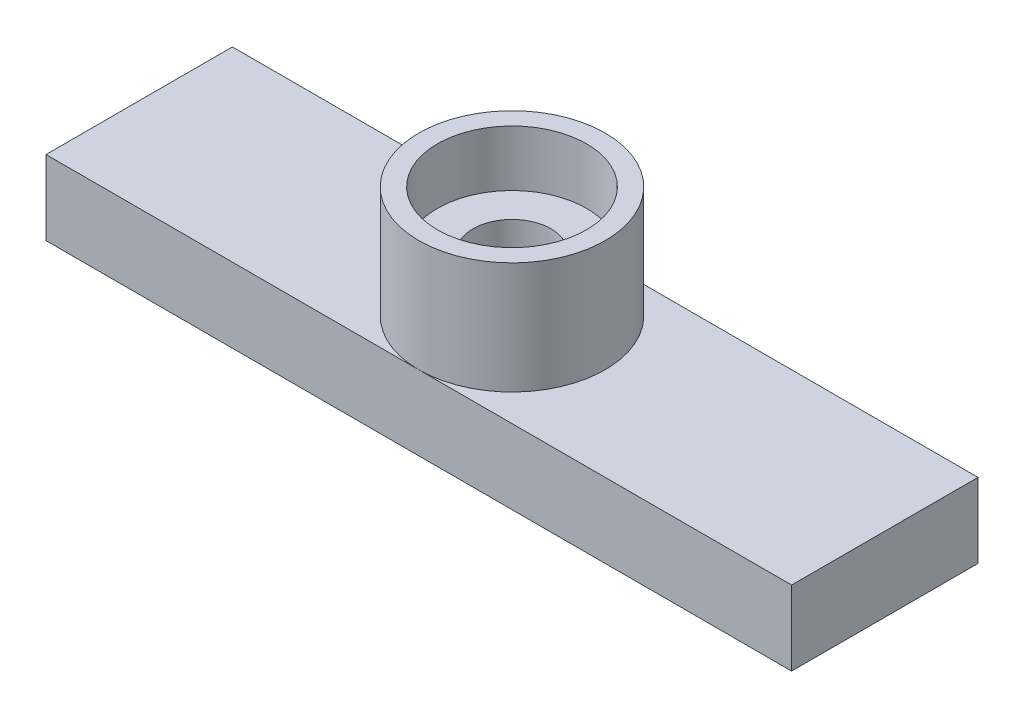
ISO-10303-21;
HEADER;
FILE_DESCRIPTION(('STEP AP214'),'2;1');
FILE_NAME('part.step','',(''),(''),'','','');
FILE_SCHEMA(('AUTOMOTIVE_DESIGN { 1 0 10303 214 1 1 1 1 }'));
ENDSEC;
DATA;
#1=APPLICATION_CONTEXT('core data for automotive mechanical design processes');
#2=APPLICATION_PROTOCOL_DEFINITION('international standard','automotive_design',2000,#1);
#3=PRODUCT_CONTEXT('',#1,'mechanical');
#4=PRODUCT('Part','Part','',(#3));
#5=PRODUCT_RELATED_PRODUCT_CATEGORY('part','',(#4));
#6=PRODUCT_DEFINITION_FORMATION('','',#4);
#7=PRODUCT_DEFINITION_CONTEXT('part definition',#1,'design');
#8=PRODUCT_DEFINITION('design','',#6,#7);
#9=PRODUCT_DEFINITION_SHAPE('','',#8);
#10=(LENGTH_UNIT() NAMED_UNIT(*) SI_UNIT(.MILLI.,.METRE.));
#11=(NAMED_UNIT(*) PLANE_ANGLE_UNIT() SI_UNIT($,.RADIAN.));
#12=(NAMED_UNIT(*) SI_UNIT($,.STERADIAN.) SOLID_ANGLE_UNIT());
#13=UNCERTAINTY_MEASURE_WITH_UNIT(LENGTH_MEASURE(1.E-05),#10,'distance_accuracy_value','');
#14=(GEOMETRIC_REPRESENTATION_CONTEXT(3) GLOBAL_UNCERTAINTY_ASSIGNED_CONTEXT((#13)) GLOBAL_UNIT_ASSIGNED_CONTEXT((#10,
#11,#12)) REPRESENTATION_CONTEXT('',''));
#15=CARTESIAN_POINT('',(0.,0.,0.));
#16=DIRECTION('',(0.,0.,1.));
#17=DIRECTION('',(1.,0.,0.));
#18=AXIS2_PLACEMENT_3D('',#15,#16,#17);
#19=CARTESIAN_POINT('',(0.,0.,0.));
#20=DIRECTION('',(0.,1.,0.));
#21=DIRECTION('',(0.,0.,1.));
#22=AXIS2_PLACEMENT_3D('',#19,#20,#21);
#23=PLANE('',#22);
#24=CARTESIAN_POINT('',(0.,0.,0.));
#25=DIRECTION('',(0.,1.,0.));
#26=DIRECTION('',(0.,0.,1.));
#27=AXIS2_PLACEMENT_3D('',#24,#25,#26);
#28=CIRCLE('',#27,2.1);
#29=CARTESIAN_POINT('',(0.,0.,2.1));
#30=VERTEX_POINT('',#29);
#31=EDGE_CURVE('E36',#30,#30,#28,.T.);
#32=ORIENTED_EDGE('',*,*,#31,.T.);
#33=EDGE_LOOP('',(#32));
#34=FACE_BOUND('',#33,.T.);
#35=CARTESIAN_POINT('',(0.,0.,0.));
#36=DIRECTION('',(0.,1.,0.));
#37=DIRECTION('',(0.,0.,1.));
#38=AXIS2_PLACEMENT_3D('',#35,#36,#37);
#39=CIRCLE('',#38,4.);
#40=CARTESIAN_POINT('',(0.,0.,4.));
#41=VERTEX_POINT('',#40);
#42=EDGE_CURVE('E11',#41,#41,#39,.T.);
#43=ORIENTED_EDGE('',*,*,#42,.F.);
#44=EDGE_LOOP('',(#43));
#45=FACE_BOUND('',#44,.T.);
#46=ADVANCED_FACE('F33',(#34,#45),#23,.F.);
#47=CARTESIAN_POINT('',(0.,3.,0.));
#48=DIRECTION('',(0.,1.,0.));
#49=DIRECTION('',(0.,0.,1.));
#50=AXIS2_PLACEMENT_3D('',#47,#48,#49);
#51=PLANE('',#50);
#52=CARTESIAN_POINT('',(0.,3.,0.));
#53=DIRECTION('',(0.,1.,0.));
#54=DIRECTION('',(0.,0.,1.));
#55=AXIS2_PLACEMENT_3D('',#52,#53,#54);
#56=CIRCLE('',#55,4.);
#57=CARTESIAN_POINT('',(0.,3.,4.));
#58=VERTEX_POINT('',#57);
#59=EDGE_CURVE('E132',#58,#58,#56,.F.);
#60=ORIENTED_EDGE('',*,*,#59,.F.);
#61=EDGE_LOOP('',(#60));
#62=FACE_BOUND('',#61,.T.);
#63=CARTESIAN_POINT('',(0.,3.,0.));
#64=DIRECTION('',(0.,1.,0.));
#65=DIRECTION('',(0.,0.,1.));
#66=AXIS2_PLACEMENT_3D('',#63,#64,#65);
#67=CIRCLE('',#66,2.1);
#68=CARTESIAN_POINT('',(0.,3.,2.1));
#69=VERTEX_POINT('',#68);
#70=EDGE_CURVE('E41',#69,#69,#67,.T.);
#71=ORIENTED_EDGE('',*,*,#70,.F.);
#72=EDGE_LOOP('',(#71));
#73=FACE_BOUND('',#72,.T.);
#74=ADVANCED_FACE('F148',(#62,#73),#51,.T.);
#75=CARTESIAN_POINT('',(0.,3.,0.));
#76=DIRECTION('',(0.,-1.,0.));
#77=DIRECTION('',(0.,0.,-1.));
#78=AXIS2_PLACEMENT_3D('',#75,#76,#77);
#79=CYLINDRICAL_SURFACE('',#78,2.1);
#80=ORIENTED_EDGE('',*,*,#70,.T.);
#81=EDGE_LOOP('',(#80));
#82=FACE_BOUND('',#81,.T.);
#83=ORIENTED_EDGE('',*,*,#31,.F.);
#84=EDGE_LOOP('',(#83));
#85=FACE_BOUND('',#84,.T.);
#86=ADVANCED_FACE('F145',(#82,#85),#79,.F.);
#87=CARTESIAN_POINT('',(0.,6.,0.));
#88=DIRECTION('',(0.,1.,0.));
#89=DIRECTION('',(0.,0.,1.));
#90=AXIS2_PLACEMENT_3D('',#87,#88,#89);
#91=PLANE('',#90);
#92=CARTESIAN_POINT('',(0.,6.,0.));
#93=DIRECTION('',(0.,1.,0.));
#94=DIRECTION('',(0.,0.,1.));
#95=AXIS2_PLACEMENT_3D('',#92,#93,#94);
#96=CIRCLE('',#95,5.);
#97=CARTESIAN_POINT('',(0.,6.,5.));
#98=VERTEX_POINT('',#97);
#99=EDGE_CURVE('E129',#98,#98,#96,.T.);
#100=ORIENTED_EDGE('',*,*,#99,.T.);
#101=EDGE_LOOP('',(#100));
#102=FACE_BOUND('',#101,.T.);
#103=CARTESIAN_POINT('',(0.,6.,0.));
#104=DIRECTION('',(0.,1.,0.));
#105=DIRECTION('',(0.,0.,1.));
#106=AXIS2_PLACEMENT_3D('',#103,#104,#105);
#107=CIRCLE('',#106,4.);
#108=CARTESIAN_POINT('',(0.,6.,4.));
#109=VERTEX_POINT('',#108);
#110=EDGE_CURVE('E123',#109,#109,#107,.T.);
#111=ORIENTED_EDGE('',*,*,#110,.F.);
#112=EDGE_LOOP('',(#111));
#113=FACE_BOUND('',#112,.T.);
#114=ADVANCED_FACE('F147',(#102,#113),#91,.T.);
#115=CARTESIAN_POINT('',(0.,6.,0.));
#116=DIRECTION('',(0.,-1.,0.));
#117=DIRECTION('',(0.,0.,-1.));
#118=AXIS2_PLACEMENT_3D('',#115,#116,#117);
#119=CYLINDRICAL_SURFACE('',#118,5.);
#120=ORIENTED_EDGE('',*,*,#99,.F.);
#121=EDGE_LOOP('',(#120));
#122=FACE_BOUND('',#121,.T.);
#123=CARTESIAN_POINT('',(0.,0.,0.));
#124=DIRECTION('',(0.,1.,0.));
#125=DIRECTION('',(0.,0.,1.));
#126=AXIS2_PLACEMENT_3D('',#123,#124,#125);
#127=CIRCLE('',#126,5.);
#128=CARTESIAN_POINT('',(0.,0.,5.));
#129=VERTEX_POINT('',#128);
#130=CARTESIAN_POINT('',(0.,0.,-5.));
#131=VERTEX_POINT('',#130);
#132=EDGE_CURVE('E133',#129,#131,#127,.T.);
#133=ORIENTED_EDGE('',*,*,#132,.T.);
#134=EDGE_CURVE('E54',#131,#129,#127,.T.);
#135=ORIENTED_EDGE('',*,*,#134,.T.);
#136=EDGE_LOOP('',(#133,#135));
#137=FACE_BOUND('',#136,.T.);
#138=ADVANCED_FACE('F154',(#122,#137),#119,.T.);
#139=CARTESIAN_POINT('',(0.,6.,0.));
#140=DIRECTION('',(0.,-1.,0.));
#141=DIRECTION('',(0.,0.,-1.));
#142=AXIS2_PLACEMENT_3D('',#139,#140,#141);
#143=CYLINDRICAL_SURFACE('',#142,4.);
#144=ORIENTED_EDGE('',*,*,#59,.T.);
#145=EDGE_LOOP('',(#144));
#146=FACE_BOUND('',#145,.T.);
#147=ORIENTED_EDGE('',*,*,#110,.T.);
#148=EDGE_LOOP('',(#147));
#149=FACE_BOUND('',#148,.T.);
#150=ADVANCED_FACE('F184',(#146,#149),#143,.F.);
#151=CARTESIAN_POINT('',(0.,0.,0.));
#152=DIRECTION('',(0.,-1.,0.));
#153=DIRECTION('',(0.,0.,-1.));
#154=AXIS2_PLACEMENT_3D('',#151,#152,#153);
#155=PLANE('',#154);
#156=ORIENTED_EDGE('',*,*,#132,.F.);
#157=DIRECTION('',(1.,0.,0.));
#158=VECTOR('',#157,1.);
#159=CARTESIAN_POINT('',(-20.,0.,5.));
#160=LINE('',#159,#158);
#161=CARTESIAN_POINT('',(20.,0.,5.));
#162=VERTEX_POINT('',#161);
#163=EDGE_CURVE('E109',#129,#162,#160,.T.);
#164=ORIENTED_EDGE('',*,*,#163,.T.);
#165=DIRECTION('',(0.,0.,-1.));
#166=VECTOR('',#165,1.);
#167=CARTESIAN_POINT('',(20.,0.,5.));
#168=LINE('',#167,#166);
#169=CARTESIAN_POINT('',(20.,0.,-5.));
#170=VERTEX_POINT('',#169);
#171=EDGE_CURVE('E115',#162,#170,#168,.T.);
#172=ORIENTED_EDGE('',*,*,#171,.T.);
#173=DIRECTION('',(-1.,0.,0.));
#174=VECTOR('',#173,1.);
#175=CARTESIAN_POINT('',(-20.,0.,-5.));
#176=LINE('',#175,#174);
#177=EDGE_CURVE('E87',#170,#131,#176,.T.);
#178=ORIENTED_EDGE('',*,*,#177,.T.);
#179=EDGE_LOOP('',(#156,#164,#172,#178));
#180=FACE_BOUND('',#179,.T.);
#181=ADVANCED_FACE('F188',(#180),#155,.F.);
#182=CARTESIAN_POINT('',(20.,-4.,5.));
#183=DIRECTION('',(1.,0.,0.));
#184=DIRECTION('',(0.,0.,-1.));
#185=AXIS2_PLACEMENT_3D('',#182,#183,#184);
#186=PLANE('',#185);
#187=ORIENTED_EDGE('',*,*,#171,.F.);
#188=DIRECTION('',(0.,1.,0.));
#189=VECTOR('',#188,1.);
#190=CARTESIAN_POINT('',(20.,-4.,5.));
#191=LINE('',#190,#189);
#192=CARTESIAN_POINT('',(20.,-4.,5.));
#193=VERTEX_POINT('',#192);
#194=EDGE_CURVE('E107',#193,#162,#191,.T.);
#195=ORIENTED_EDGE('',*,*,#194,.F.);
#196=DIRECTION('',(0.,0.,-1.));
#197=VECTOR('',#196,1.);
#198=CARTESIAN_POINT('',(20.,-4.,5.));
#199=LINE('',#198,#197);
#200=CARTESIAN_POINT('',(20.,-4.,-5.));
#201=VERTEX_POINT('',#200);
#202=EDGE_CURVE('E100',#193,#201,#199,.T.);
#203=ORIENTED_EDGE('',*,*,#202,.T.);
#204=DIRECTION('',(0.,1.,0.));
#205=VECTOR('',#204,1.);
#206=CARTESIAN_POINT('',(20.,-4.,-5.));
#207=LINE('',#206,#205);
#208=EDGE_CURVE('E81',#201,#170,#207,.T.);
#209=ORIENTED_EDGE('',*,*,#208,.T.);
#210=EDGE_LOOP('',(#187,#195,#203,#209));
#211=FACE_BOUND('',#210,.T.);
#212=ADVANCED_FACE('F105',(#211),#186,.T.);
#213=CARTESIAN_POINT('',(-20.,-4.,5.));
#214=DIRECTION('',(0.,0.,1.));
#215=DIRECTION('',(1.,0.,0.));
#216=AXIS2_PLACEMENT_3D('',#213,#214,#215);
#217=PLANE('',#216);
#218=CARTESIAN_POINT('',(-20.,0.,5.));
#219=VERTEX_POINT('',#218);
#220=EDGE_CURVE('E49',#219,#129,#160,.T.);
#221=ORIENTED_EDGE('',*,*,#220,.F.);
#222=DIRECTION('',(0.,1.,0.));
#223=VECTOR('',#222,1.);
#224=CARTESIAN_POINT('',(-20.,-4.,5.));
#225=LINE('',#224,#223);
#226=CARTESIAN_POINT('',(-20.,-4.,5.));
#227=VERTEX_POINT('',#226);
#228=EDGE_CURVE('E124',#227,#219,#225,.T.);
#229=ORIENTED_EDGE('',*,*,#228,.F.);
#230=DIRECTION('',(1.,0.,0.));
#231=VECTOR('',#230,1.);
#232=CARTESIAN_POINT('',(-20.,-4.,5.));
#233=LINE('',#232,#231);
#234=EDGE_CURVE('E93',#227,#193,#233,.T.);
#235=ORIENTED_EDGE('',*,*,#234,.T.);
#236=ORIENTED_EDGE('',*,*,#194,.T.);
#237=ORIENTED_EDGE('',*,*,#163,.F.);
#238=EDGE_LOOP('',(#221,#229,#235,#236,#237));
#239=FACE_BOUND('',#238,.T.);
#240=ADVANCED_FACE('F208',(#239),#217,.T.);
#241=CARTESIAN_POINT('',(-20.,-4.,5.));
#242=DIRECTION('',(-1.,0.,0.));
#243=DIRECTION('',(0.,0.,1.));
#244=AXIS2_PLACEMENT_3D('',#241,#242,#243);
#245=PLANE('',#244);
#246=DIRECTION('',(0.,0.,1.));
#247=VECTOR('',#246,1.);
#248=CARTESIAN_POINT('',(-20.,0.,5.));
#249=LINE('',#248,#247);
#250=CARTESIAN_POINT('',(-20.,0.,-5.));
#251=VERTEX_POINT('',#250);
#252=EDGE_CURVE('E120',#251,#219,#249,.T.);
#253=ORIENTED_EDGE('',*,*,#252,.F.);
#254=DIRECTION('',(0.,1.,0.));
#255=VECTOR('',#254,1.);
#256=CARTESIAN_POINT('',(-20.,-4.,-5.));
#257=LINE('',#256,#255);
#258=CARTESIAN_POINT('',(-20.,-4.,-5.));
#259=VERTEX_POINT('',#258);
#260=EDGE_CURVE('E92',#259,#251,#257,.T.);
#261=ORIENTED_EDGE('',*,*,#260,.F.);
#262=DIRECTION('',(0.,0.,1.));
#263=VECTOR('',#262,1.);
#264=CARTESIAN_POINT('',(-20.,-4.,5.));
#265=LINE('',#264,#263);
#266=EDGE_CURVE('E103',#259,#227,#265,.T.);
#267=ORIENTED_EDGE('',*,*,#266,.T.);
#268=ORIENTED_EDGE('',*,*,#228,.T.);
#269=EDGE_LOOP('',(#253,#261,#267,#268));
#270=FACE_BOUND('',#269,.T.);
#271=ADVANCED_FACE('F215',(#270),#245,.T.);
#272=CARTESIAN_POINT('',(-20.,-4.,-5.));
#273=DIRECTION('',(0.,0.,-1.));
#274=DIRECTION('',(-1.,0.,0.));
#275=AXIS2_PLACEMENT_3D('',#272,#273,#274);
#276=PLANE('',#275);
#277=ORIENTED_EDGE('',*,*,#177,.F.);
#278=ORIENTED_EDGE('',*,*,#208,.F.);
#279=DIRECTION('',(-1.,0.,0.));
#280=VECTOR('',#279,1.);
#281=CARTESIAN_POINT('',(-20.,-4.,-5.));
#282=LINE('',#281,#280);
#283=EDGE_CURVE('E85',#201,#259,#282,.T.);
#284=ORIENTED_EDGE('',*,*,#283,.T.);
#285=ORIENTED_EDGE('',*,*,#260,.T.);
#286=EDGE_CURVE('E117',#131,#251,#176,.T.);
#287=ORIENTED_EDGE('',*,*,#286,.F.);
#288=EDGE_LOOP('',(#277,#278,#284,#285,#287));
#289=FACE_BOUND('',#288,.T.);
#290=ADVANCED_FACE('F83',(#289),#276,.T.);
#291=CARTESIAN_POINT('',(0.,-4.,0.));
#292=DIRECTION('',(0.,-1.,0.));
#293=DIRECTION('',(0.,0.,-1.));
#294=AXIS2_PLACEMENT_3D('',#291,#292,#293);
#295=PLANE('',#294);
#296=CARTESIAN_POINT('',(0.,-4.,0.));
#297=DIRECTION('',(0.,1.,0.));
#298=DIRECTION('',(0.,0.,1.));
#299=AXIS2_PLACEMENT_3D('',#296,#297,#298);
#300=CIRCLE('',#299,4.);
#301=CARTESIAN_POINT('',(0.,-4.,4.));
#302=VERTEX_POINT('',#301);
#303=EDGE_CURVE('E118',#302,#302,#300,.T.);
#304=ORIENTED_EDGE('',*,*,#303,.T.);
#305=EDGE_LOOP('',(#304));
#306=FACE_BOUND('',#305,.T.);
#307=ORIENTED_EDGE('',*,*,#202,.F.);
#308=ORIENTED_EDGE('',*,*,#234,.F.);
#309=ORIENTED_EDGE('',*,*,#266,.F.);
#310=ORIENTED_EDGE('',*,*,#283,.F.);
#311=EDGE_LOOP('',(#307,#308,#309,#310));
#312=FACE_BOUND('',#311,.T.);
#313=ADVANCED_FACE('F98',(#306,#312),#295,.T.);
#314=ORIENTED_EDGE('',*,*,#134,.F.);
#315=ORIENTED_EDGE('',*,*,#286,.T.);
#316=ORIENTED_EDGE('',*,*,#252,.T.);
#317=ORIENTED_EDGE('',*,*,#220,.T.);
#318=EDGE_LOOP('',(#314,#315,#316,#317));
#319=FACE_BOUND('',#318,.T.);
#320=ADVANCED_FACE('F202',(#319),#155,.F.);
#321=CARTESIAN_POINT('',(0.,-4.,0.));
#322=DIRECTION('',(0.,1.,0.));
#323=DIRECTION('',(0.,0.,1.));
#324=AXIS2_PLACEMENT_3D('',#321,#322,#323);
#325=CYLINDRICAL_SURFACE('',#324,4.);
#326=ORIENTED_EDGE('',*,*,#303,.F.);
#327=EDGE_LOOP('',(#326));
#328=FACE_BOUND('',#327,.T.);
#329=ORIENTED_EDGE('',*,*,#42,.T.);
#330=EDGE_LOOP('',(#329));
#331=FACE_BOUND('',#330,.T.);
#332=ADVANCED_FACE('F243',(#328,#331),#325,.F.);
#333=CLOSED_SHELL('',(#46,#74,#86,#114,#138,#150,#181,#212,#240,#271,#290,#313,#320,#332));
#334=MANIFOLD_SOLID_BREP('B2',#333);
#335=ADVANCED_BREP_SHAPE_REPRESENTATION('',(#18,#334),#14);
#336=SHAPE_DEFINITION_REPRESENTATION(#9,#335);
ENDSEC;
END-ISO-10303-21;
